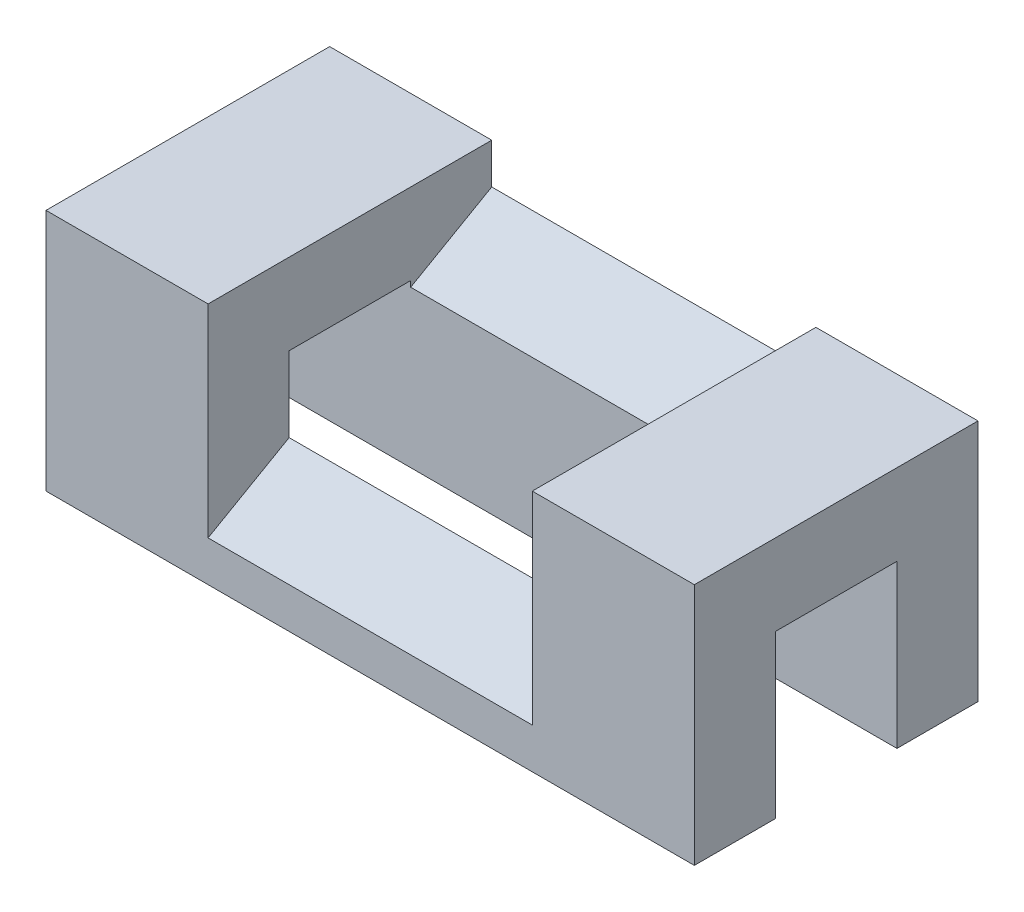
ISO-10303-21;
HEADER;
FILE_DESCRIPTION(('STEP AP214'),'2;1');
FILE_NAME('part.step','',(''),(''),'','','');
FILE_SCHEMA(('AUTOMOTIVE_DESIGN { 1 0 10303 214 1 1 1 1 }'));
ENDSEC;
DATA;
#1=APPLICATION_CONTEXT('core data for automotive mechanical design processes');
#2=APPLICATION_PROTOCOL_DEFINITION('international standard','automotive_design',2000,#1);
#3=PRODUCT_CONTEXT('',#1,'mechanical');
#4=PRODUCT('Part','Part','',(#3));
#5=PRODUCT_RELATED_PRODUCT_CATEGORY('part','',(#4));
#6=PRODUCT_DEFINITION_FORMATION('','',#4);
#7=PRODUCT_DEFINITION_CONTEXT('part definition',#1,'design');
#8=PRODUCT_DEFINITION('design','',#6,#7);
#9=PRODUCT_DEFINITION_SHAPE('','',#8);
#10=(LENGTH_UNIT() NAMED_UNIT(*) SI_UNIT(.MILLI.,.METRE.));
#11=(NAMED_UNIT(*) PLANE_ANGLE_UNIT() SI_UNIT($,.RADIAN.));
#12=(NAMED_UNIT(*) SI_UNIT($,.STERADIAN.) SOLID_ANGLE_UNIT());
#13=UNCERTAINTY_MEASURE_WITH_UNIT(LENGTH_MEASURE(1.E-05),#10,'distance_accuracy_value','');
#14=(GEOMETRIC_REPRESENTATION_CONTEXT(3) GLOBAL_UNCERTAINTY_ASSIGNED_CONTEXT((#13)) GLOBAL_UNIT_ASSIGNED_CONTEXT((#10,
#11,#12)) REPRESENTATION_CONTEXT('',''));
#15=CARTESIAN_POINT('',(0.,0.,0.));
#16=DIRECTION('',(0.,0.,1.));
#17=DIRECTION('',(1.,0.,0.));
#18=AXIS2_PLACEMENT_3D('',#15,#16,#17);
#19=CARTESIAN_POINT('',(40.,15.,17.5));
#20=DIRECTION('',(0.,0.,-1.));
#21=DIRECTION('',(0.,1.,0.));
#22=AXIS2_PLACEMENT_3D('',#19,#20,#21);
#23=PLANE('',#22);
#24=DIRECTION('',(0.,-1.,0.));
#25=VECTOR('',#24,1.);
#26=CARTESIAN_POINT('',(-20.,0.,17.5));
#27=LINE('',#26,#25);
#28=CARTESIAN_POINT('',(-20.,15.,17.5));
#29=VERTEX_POINT('',#28);
#30=CARTESIAN_POINT('',(-20.,-10.,17.5));
#31=VERTEX_POINT('',#30);
#32=EDGE_CURVE('E148',#29,#31,#27,.T.);
#33=ORIENTED_EDGE('',*,*,#32,.F.);
#34=DIRECTION('',(-1.,0.,0.));
#35=VECTOR('',#34,1.);
#36=CARTESIAN_POINT('',(40.,15.,17.5));
#37=LINE('',#36,#35);
#38=CARTESIAN_POINT('',(-40.,15.,17.5));
#39=VERTEX_POINT('',#38);
#40=EDGE_CURVE('E160',#29,#39,#37,.T.);
#41=ORIENTED_EDGE('',*,*,#40,.T.);
#42=DIRECTION('',(0.,-1.,0.));
#43=VECTOR('',#42,1.);
#44=CARTESIAN_POINT('',(-40.,15.,17.5));
#45=LINE('',#44,#43);
#46=CARTESIAN_POINT('',(-40.,-15.,17.5));
#47=VERTEX_POINT('',#46);
#48=EDGE_CURVE('E236',#39,#47,#45,.T.);
#49=ORIENTED_EDGE('',*,*,#48,.T.);
#50=DIRECTION('',(-1.,0.,0.));
#51=VECTOR('',#50,1.);
#52=CARTESIAN_POINT('',(40.,-15.,17.5));
#53=LINE('',#52,#51);
#54=CARTESIAN_POINT('',(40.,-15.,17.5));
#55=VERTEX_POINT('',#54);
#56=EDGE_CURVE('E185',#55,#47,#53,.T.);
#57=ORIENTED_EDGE('',*,*,#56,.F.);
#58=DIRECTION('',(0.,-1.,0.));
#59=VECTOR('',#58,1.);
#60=CARTESIAN_POINT('',(40.,15.,17.5));
#61=LINE('',#60,#59);
#62=CARTESIAN_POINT('',(40.,15.,17.5));
#63=VERTEX_POINT('',#62);
#64=EDGE_CURVE('E237',#63,#55,#61,.T.);
#65=ORIENTED_EDGE('',*,*,#64,.F.);
#66=CARTESIAN_POINT('',(20.,15.,17.5));
#67=VERTEX_POINT('',#66);
#68=EDGE_CURVE('E169',#63,#67,#37,.T.);
#69=ORIENTED_EDGE('',*,*,#68,.T.);
#70=DIRECTION('',(0.,-1.,0.));
#71=VECTOR('',#70,1.);
#72=CARTESIAN_POINT('',(20.,0.,17.5));
#73=LINE('',#72,#71);
#74=CARTESIAN_POINT('',(20.,-10.,17.5));
#75=VERTEX_POINT('',#74);
#76=EDGE_CURVE('E47',#67,#75,#73,.T.);
#77=ORIENTED_EDGE('',*,*,#76,.T.);
#78=DIRECTION('',(1.,0.,0.));
#79=VECTOR('',#78,1.);
#80=CARTESIAN_POINT('',(-20.,-10.,17.5));
#81=LINE('',#80,#79);
#82=EDGE_CURVE('E162',#31,#75,#81,.T.);
#83=ORIENTED_EDGE('',*,*,#82,.F.);
#84=EDGE_LOOP('',(#33,#41,#49,#57,#65,#69,#77,#83));
#85=FACE_BOUND('',#84,.T.);
#86=ADVANCED_FACE('F33',(#85),#23,.F.);
#87=CARTESIAN_POINT('',(40.,15.,-17.5));
#88=DIRECTION('',(0.,0.,1.));
#89=DIRECTION('',(0.,-1.,0.));
#90=AXIS2_PLACEMENT_3D('',#87,#88,#89);
#91=PLANE('',#90);
#92=DIRECTION('',(0.,1.,0.));
#93=VECTOR('',#92,1.);
#94=CARTESIAN_POINT('',(-20.,0.,-17.5));
#95=LINE('',#94,#93);
#96=CARTESIAN_POINT('',(-20.,10.,-17.5));
#97=VERTEX_POINT('',#96);
#98=CARTESIAN_POINT('',(-20.,15.,-17.5));
#99=VERTEX_POINT('',#98);
#100=EDGE_CURVE('E152',#97,#99,#95,.T.);
#101=ORIENTED_EDGE('',*,*,#100,.F.);
#102=DIRECTION('',(1.,0.,0.));
#103=VECTOR('',#102,1.);
#104=CARTESIAN_POINT('',(-20.,10.,-17.5));
#105=LINE('',#104,#103);
#106=CARTESIAN_POINT('',(20.,10.,-17.5));
#107=VERTEX_POINT('',#106);
#108=EDGE_CURVE('E224',#97,#107,#105,.T.);
#109=ORIENTED_EDGE('',*,*,#108,.T.);
#110=DIRECTION('',(0.,1.,0.));
#111=VECTOR('',#110,1.);
#112=CARTESIAN_POINT('',(20.,0.,-17.5));
#113=LINE('',#112,#111);
#114=CARTESIAN_POINT('',(20.,15.,-17.5));
#115=VERTEX_POINT('',#114);
#116=EDGE_CURVE('E156',#107,#115,#113,.T.);
#117=ORIENTED_EDGE('',*,*,#116,.T.);
#118=DIRECTION('',(-1.,0.,0.));
#119=VECTOR('',#118,1.);
#120=CARTESIAN_POINT('',(40.,15.,-17.5));
#121=LINE('',#120,#119);
#122=CARTESIAN_POINT('',(40.,15.,-17.5));
#123=VERTEX_POINT('',#122);
#124=EDGE_CURVE('E179',#123,#115,#121,.T.);
#125=ORIENTED_EDGE('',*,*,#124,.F.);
#126=DIRECTION('',(0.,1.,0.));
#127=VECTOR('',#126,1.);
#128=CARTESIAN_POINT('',(40.,15.,-17.5));
#129=LINE('',#128,#127);
#130=CARTESIAN_POINT('',(40.,-15.,-17.5));
#131=VERTEX_POINT('',#130);
#132=EDGE_CURVE('E174',#131,#123,#129,.T.);
#133=ORIENTED_EDGE('',*,*,#132,.F.);
#134=DIRECTION('',(-1.,0.,0.));
#135=VECTOR('',#134,1.);
#136=CARTESIAN_POINT('',(40.,-15.,-17.5));
#137=LINE('',#136,#135);
#138=CARTESIAN_POINT('',(-40.,-15.,-17.5));
#139=VERTEX_POINT('',#138);
#140=EDGE_CURVE('E182',#131,#139,#137,.T.);
#141=ORIENTED_EDGE('',*,*,#140,.T.);
#142=DIRECTION('',(0.,1.,0.));
#143=VECTOR('',#142,1.);
#144=CARTESIAN_POINT('',(-40.,15.,-17.5));
#145=LINE('',#144,#143);
#146=CARTESIAN_POINT('',(-40.,15.,-17.5));
#147=VERTEX_POINT('',#146);
#148=EDGE_CURVE('E247',#139,#147,#145,.T.);
#149=ORIENTED_EDGE('',*,*,#148,.T.);
#150=EDGE_CURVE('E173',#99,#147,#121,.T.);
#151=ORIENTED_EDGE('',*,*,#150,.F.);
#152=EDGE_LOOP('',(#101,#109,#117,#125,#133,#141,#149,#151));
#153=FACE_BOUND('',#152,.T.);
#154=ADVANCED_FACE('F250',(#153),#91,.F.);
#155=CARTESIAN_POINT('',(40.,15.,17.5));
#156=DIRECTION('',(0.,-1.,0.));
#157=DIRECTION('',(0.,0.,-1.));
#158=AXIS2_PLACEMENT_3D('',#155,#156,#157);
#159=PLANE('',#158);
#160=DIRECTION('',(0.,0.,1.));
#161=VECTOR('',#160,1.);
#162=CARTESIAN_POINT('',(-20.,15.,0.));
#163=LINE('',#162,#161);
#164=EDGE_CURVE('E144',#99,#29,#163,.T.);
#165=ORIENTED_EDGE('',*,*,#164,.F.);
#166=ORIENTED_EDGE('',*,*,#150,.T.);
#167=DIRECTION('',(0.,0.,1.));
#168=VECTOR('',#167,1.);
#169=CARTESIAN_POINT('',(-40.,15.,17.5));
#170=LINE('',#169,#168);
#171=EDGE_CURVE('E167',#147,#39,#170,.T.);
#172=ORIENTED_EDGE('',*,*,#171,.T.);
#173=ORIENTED_EDGE('',*,*,#40,.F.);
#174=EDGE_LOOP('',(#165,#166,#172,#173));
#175=FACE_BOUND('',#174,.T.);
#176=ADVANCED_FACE('F165',(#175),#159,.F.);
#177=CARTESIAN_POINT('',(-70.,0.,7.50000000000001));
#178=DIRECTION('',(0.,0.,-1.));
#179=DIRECTION('',(-1.,0.,0.));
#180=AXIS2_PLACEMENT_3D('',#177,#178,#179);
#181=PLANE('',#180);
#182=DIRECTION('',(1.,0.,0.));
#183=VECTOR('',#182,1.);
#184=CARTESIAN_POINT('',(-70.,5.,7.50000000000001));
#185=LINE('',#184,#183);
#186=CARTESIAN_POINT('',(-40.,5.,7.50000000000001));
#187=VERTEX_POINT('',#186);
#188=CARTESIAN_POINT('',(-20.,5.,7.50000000000001));
#189=VERTEX_POINT('',#188);
#190=EDGE_CURVE('E199',#187,#189,#185,.T.);
#191=ORIENTED_EDGE('',*,*,#190,.T.);
#192=DIRECTION('',(0.,1.,0.));
#193=VECTOR('',#192,1.);
#194=CARTESIAN_POINT('',(-20.,0.,7.50000000000001));
#195=LINE('',#194,#193);
#196=CARTESIAN_POINT('',(-20.,-4.28571428571428,7.50000000000001));
#197=VERTEX_POINT('',#196);
#198=EDGE_CURVE('E299',#197,#189,#195,.T.);
#199=ORIENTED_EDGE('',*,*,#198,.F.);
#200=DIRECTION('',(1.,0.,0.));
#201=VECTOR('',#200,1.);
#202=CARTESIAN_POINT('',(-20.,-4.28571428571428,7.50000000000001));
#203=LINE('',#202,#201);
#204=CARTESIAN_POINT('',(20.,-4.28571428571428,7.50000000000001));
#205=VERTEX_POINT('',#204);
#206=EDGE_CURVE('E285',#197,#205,#203,.T.);
#207=ORIENTED_EDGE('',*,*,#206,.T.);
#208=DIRECTION('',(0.,1.,0.));
#209=VECTOR('',#208,1.);
#210=CARTESIAN_POINT('',(20.,0.,7.50000000000001));
#211=LINE('',#210,#209);
#212=CARTESIAN_POINT('',(20.,5.,7.50000000000001));
#213=VERTEX_POINT('',#212);
#214=EDGE_CURVE('E266',#205,#213,#211,.T.);
#215=ORIENTED_EDGE('',*,*,#214,.T.);
#216=CARTESIAN_POINT('',(40.,5.,7.50000000000001));
#217=VERTEX_POINT('',#216);
#218=EDGE_CURVE('E288',#213,#217,#185,.T.);
#219=ORIENTED_EDGE('',*,*,#218,.T.);
#220=DIRECTION('',(0.,1.,0.));
#221=VECTOR('',#220,1.);
#222=CARTESIAN_POINT('',(40.,0.,7.50000000000001));
#223=LINE('',#222,#221);
#224=CARTESIAN_POINT('',(40.,-15.,7.50000000000001));
#225=VERTEX_POINT('',#224);
#226=EDGE_CURVE('E233',#225,#217,#223,.T.);
#227=ORIENTED_EDGE('',*,*,#226,.F.);
#228=DIRECTION('',(1.,0.,0.));
#229=VECTOR('',#228,1.);
#230=CARTESIAN_POINT('',(-70.,-15.,7.50000000000001));
#231=LINE('',#230,#229);
#232=CARTESIAN_POINT('',(-40.,-15.,7.50000000000001));
#233=VERTEX_POINT('',#232);
#234=EDGE_CURVE('E220',#233,#225,#231,.T.);
#235=ORIENTED_EDGE('',*,*,#234,.F.);
#236=DIRECTION('',(0.,1.,0.));
#237=VECTOR('',#236,1.);
#238=CARTESIAN_POINT('',(-40.,0.,7.50000000000001));
#239=LINE('',#238,#237);
#240=EDGE_CURVE('E11',#233,#187,#239,.T.);
#241=ORIENTED_EDGE('',*,*,#240,.T.);
#242=EDGE_LOOP('',(#191,#199,#207,#215,#219,#227,#235,#241));
#243=FACE_BOUND('',#242,.T.);
#244=ADVANCED_FACE('F293',(#243),#181,.T.);
#245=CARTESIAN_POINT('',(-70.,5.,0.));
#246=DIRECTION('',(0.,-1.,0.));
#247=DIRECTION('',(0.,0.,-1.));
#248=AXIS2_PLACEMENT_3D('',#245,#246,#247);
#249=PLANE('',#248);
#250=DIRECTION('',(1.,0.,0.));
#251=VECTOR('',#250,1.);
#252=CARTESIAN_POINT('',(-70.,5.,-7.50000000000001));
#253=LINE('',#252,#251);
#254=CARTESIAN_POINT('',(-40.,5.,-7.50000000000001));
#255=VERTEX_POINT('',#254);
#256=CARTESIAN_POINT('',(-20.,5.,-7.50000000000001));
#257=VERTEX_POINT('',#256);
#258=EDGE_CURVE('E197',#255,#257,#253,.T.);
#259=ORIENTED_EDGE('',*,*,#258,.T.);
#260=DIRECTION('',(0.,0.,-1.));
#261=VECTOR('',#260,1.);
#262=CARTESIAN_POINT('',(-20.,5.,0.));
#263=LINE('',#262,#261);
#264=EDGE_CURVE('E304',#189,#257,#263,.T.);
#265=ORIENTED_EDGE('',*,*,#264,.F.);
#266=ORIENTED_EDGE('',*,*,#190,.F.);
#267=DIRECTION('',(0.,0.,-1.));
#268=VECTOR('',#267,1.);
#269=CARTESIAN_POINT('',(-40.,5.,0.));
#270=LINE('',#269,#268);
#271=EDGE_CURVE('E40',#187,#255,#270,.T.);
#272=ORIENTED_EDGE('',*,*,#271,.T.);
#273=EDGE_LOOP('',(#259,#265,#266,#272));
#274=FACE_BOUND('',#273,.T.);
#275=ADVANCED_FACE('F195',(#274),#249,.T.);
#276=CARTESIAN_POINT('',(-70.,0.,-7.50000000000001));
#277=DIRECTION('',(0.,0.,1.));
#278=DIRECTION('',(0.,-1.,0.));
#279=AXIS2_PLACEMENT_3D('',#276,#277,#278);
#280=PLANE('',#279);
#281=DIRECTION('',(1.,0.,0.));
#282=VECTOR('',#281,1.);
#283=CARTESIAN_POINT('',(-20.,4.28571428571429,-7.50000000000001));
#284=LINE('',#283,#282);
#285=CARTESIAN_POINT('',(-20.,4.28571428571429,-7.50000000000001));
#286=VERTEX_POINT('',#285);
#287=CARTESIAN_POINT('',(20.,4.28571428571429,-7.50000000000001));
#288=VERTEX_POINT('',#287);
#289=EDGE_CURVE('E283',#286,#288,#284,.T.);
#290=ORIENTED_EDGE('',*,*,#289,.F.);
#291=DIRECTION('',(0.,-1.,0.));
#292=VECTOR('',#291,1.);
#293=CARTESIAN_POINT('',(-20.,0.,-7.50000000000001));
#294=LINE('',#293,#292);
#295=EDGE_CURVE('E306',#257,#286,#294,.T.);
#296=ORIENTED_EDGE('',*,*,#295,.F.);
#297=ORIENTED_EDGE('',*,*,#258,.F.);
#298=DIRECTION('',(0.,-1.,0.));
#299=VECTOR('',#298,1.);
#300=CARTESIAN_POINT('',(-40.,0.,-7.50000000000001));
#301=LINE('',#300,#299);
#302=CARTESIAN_POINT('',(-40.,-15.,-7.50000000000001));
#303=VERTEX_POINT('',#302);
#304=EDGE_CURVE('E188',#255,#303,#301,.T.);
#305=ORIENTED_EDGE('',*,*,#304,.T.);
#306=DIRECTION('',(1.,0.,0.));
#307=VECTOR('',#306,1.);
#308=CARTESIAN_POINT('',(-70.,-15.,-7.50000000000001));
#309=LINE('',#308,#307);
#310=CARTESIAN_POINT('',(40.,-15.,-7.50000000000001));
#311=VERTEX_POINT('',#310);
#312=EDGE_CURVE('E211',#303,#311,#309,.T.);
#313=ORIENTED_EDGE('',*,*,#312,.T.);
#314=DIRECTION('',(0.,-1.,0.));
#315=VECTOR('',#314,1.);
#316=CARTESIAN_POINT('',(40.,0.,-7.50000000000001));
#317=LINE('',#316,#315);
#318=CARTESIAN_POINT('',(40.,5.,-7.50000000000001));
#319=VERTEX_POINT('',#318);
#320=EDGE_CURVE('E228',#319,#311,#317,.T.);
#321=ORIENTED_EDGE('',*,*,#320,.F.);
#322=CARTESIAN_POINT('',(20.,5.,-7.50000000000001));
#323=VERTEX_POINT('',#322);
#324=EDGE_CURVE('E219',#323,#319,#253,.T.);
#325=ORIENTED_EDGE('',*,*,#324,.F.);
#326=DIRECTION('',(0.,-1.,0.));
#327=VECTOR('',#326,1.);
#328=CARTESIAN_POINT('',(20.,0.,-7.50000000000001));
#329=LINE('',#328,#327);
#330=EDGE_CURVE('E276',#323,#288,#329,.T.);
#331=ORIENTED_EDGE('',*,*,#330,.T.);
#332=EDGE_LOOP('',(#290,#296,#297,#305,#313,#321,#325,#331));
#333=FACE_BOUND('',#332,.T.);
#334=ADVANCED_FACE('F209',(#333),#280,.T.);
#335=CARTESIAN_POINT('',(40.,-15.,17.5));
#336=DIRECTION('',(0.,1.,0.));
#337=DIRECTION('',(0.,0.,1.));
#338=AXIS2_PLACEMENT_3D('',#335,#336,#337);
#339=PLANE('',#338);
#340=ORIENTED_EDGE('',*,*,#234,.T.);
#341=DIRECTION('',(0.,0.,-1.));
#342=VECTOR('',#341,1.);
#343=CARTESIAN_POINT('',(40.,-15.,17.5));
#344=LINE('',#343,#342);
#345=EDGE_CURVE('E240',#55,#225,#344,.T.);
#346=ORIENTED_EDGE('',*,*,#345,.F.);
#347=ORIENTED_EDGE('',*,*,#56,.T.);
#348=DIRECTION('',(0.,0.,-1.));
#349=VECTOR('',#348,1.);
#350=CARTESIAN_POINT('',(-40.,-15.,17.5));
#351=LINE('',#350,#349);
#352=EDGE_CURVE('E245',#47,#233,#351,.T.);
#353=ORIENTED_EDGE('',*,*,#352,.T.);
#354=EDGE_LOOP('',(#340,#346,#347,#353));
#355=FACE_BOUND('',#354,.T.);
#356=ADVANCED_FACE('F255',(#355),#339,.F.);
#357=ORIENTED_EDGE('',*,*,#312,.F.);
#358=EDGE_CURVE('E205',#303,#139,#351,.T.);
#359=ORIENTED_EDGE('',*,*,#358,.T.);
#360=ORIENTED_EDGE('',*,*,#140,.F.);
#361=EDGE_CURVE('E218',#311,#131,#344,.T.);
#362=ORIENTED_EDGE('',*,*,#361,.F.);
#363=EDGE_LOOP('',(#357,#359,#360,#362));
#364=FACE_BOUND('',#363,.T.);
#365=ADVANCED_FACE('F216',(#364),#339,.F.);
#366=CARTESIAN_POINT('',(40.,0.,0.));
#367=DIRECTION('',(1.,0.,0.));
#368=DIRECTION('',(0.,0.,-1.));
#369=AXIS2_PLACEMENT_3D('',#366,#367,#368);
#370=PLANE('',#369);
#371=ORIENTED_EDGE('',*,*,#345,.T.);
#372=ORIENTED_EDGE('',*,*,#226,.T.);
#373=DIRECTION('',(0.,0.,-1.));
#374=VECTOR('',#373,1.);
#375=CARTESIAN_POINT('',(40.,5.,0.));
#376=LINE('',#375,#374);
#377=EDGE_CURVE('E230',#217,#319,#376,.T.);
#378=ORIENTED_EDGE('',*,*,#377,.T.);
#379=ORIENTED_EDGE('',*,*,#320,.T.);
#380=ORIENTED_EDGE('',*,*,#361,.T.);
#381=ORIENTED_EDGE('',*,*,#132,.T.);
#382=DIRECTION('',(0.,0.,1.));
#383=VECTOR('',#382,1.);
#384=CARTESIAN_POINT('',(40.,15.,17.5));
#385=LINE('',#384,#383);
#386=EDGE_CURVE('E170',#123,#63,#385,.T.);
#387=ORIENTED_EDGE('',*,*,#386,.T.);
#388=ORIENTED_EDGE('',*,*,#64,.T.);
#389=EDGE_LOOP('',(#371,#372,#378,#379,#380,#381,#387,#388));
#390=FACE_BOUND('',#389,.T.);
#391=ADVANCED_FACE('F257',(#390),#370,.T.);
#392=CARTESIAN_POINT('',(-40.,0.,0.));
#393=DIRECTION('',(1.,0.,0.));
#394=DIRECTION('',(0.,0.,-1.));
#395=AXIS2_PLACEMENT_3D('',#392,#393,#394);
#396=PLANE('',#395);
#397=ORIENTED_EDGE('',*,*,#240,.F.);
#398=ORIENTED_EDGE('',*,*,#352,.F.);
#399=ORIENTED_EDGE('',*,*,#48,.F.);
#400=ORIENTED_EDGE('',*,*,#171,.F.);
#401=ORIENTED_EDGE('',*,*,#148,.F.);
#402=ORIENTED_EDGE('',*,*,#358,.F.);
#403=ORIENTED_EDGE('',*,*,#304,.F.);
#404=ORIENTED_EDGE('',*,*,#271,.F.);
#405=EDGE_LOOP('',(#397,#398,#399,#400,#401,#402,#403,#404));
#406=FACE_BOUND('',#405,.T.);
#407=ADVANCED_FACE('F203',(#406),#396,.F.);
#408=ORIENTED_EDGE('',*,*,#124,.T.);
#409=DIRECTION('',(0.,0.,1.));
#410=VECTOR('',#409,1.);
#411=CARTESIAN_POINT('',(20.,15.,0.));
#412=LINE('',#411,#410);
#413=EDGE_CURVE('E263',#115,#67,#412,.T.);
#414=ORIENTED_EDGE('',*,*,#413,.T.);
#415=ORIENTED_EDGE('',*,*,#68,.F.);
#416=ORIENTED_EDGE('',*,*,#386,.F.);
#417=EDGE_LOOP('',(#408,#414,#415,#416));
#418=FACE_BOUND('',#417,.T.);
#419=ADVANCED_FACE('F262',(#418),#159,.F.);
#420=DIRECTION('',(0.,0.,-1.));
#421=VECTOR('',#420,1.);
#422=CARTESIAN_POINT('',(20.,5.,0.));
#423=LINE('',#422,#421);
#424=EDGE_CURVE('E273',#213,#323,#423,.T.);
#425=ORIENTED_EDGE('',*,*,#424,.T.);
#426=ORIENTED_EDGE('',*,*,#324,.T.);
#427=ORIENTED_EDGE('',*,*,#377,.F.);
#428=ORIENTED_EDGE('',*,*,#218,.F.);
#429=EDGE_LOOP('',(#425,#426,#427,#428));
#430=FACE_BOUND('',#429,.T.);
#431=ADVANCED_FACE('F296',(#430),#249,.T.);
#432=CARTESIAN_POINT('',(-20.,0.,0.));
#433=DIRECTION('',(0.,0.868243142124459,0.496138938356834));
#434=DIRECTION('',(0.,-0.496138938356834,0.868243142124459));
#435=AXIS2_PLACEMENT_3D('',#432,#433,#434);
#436=PLANE('',#435);
#437=DIRECTION('',(0.,-0.496138938356834,0.868243142124459));
#438=VECTOR('',#437,1.);
#439=CARTESIAN_POINT('',(20.,0.,0.));
#440=LINE('',#439,#438);
#441=EDGE_CURVE('E54',#107,#288,#440,.T.);
#442=ORIENTED_EDGE('',*,*,#441,.F.);
#443=ORIENTED_EDGE('',*,*,#108,.F.);
#444=DIRECTION('',(0.,-0.496138938356834,0.868243142124459));
#445=VECTOR('',#444,1.);
#446=CARTESIAN_POINT('',(-20.,0.,0.));
#447=LINE('',#446,#445);
#448=EDGE_CURVE('E303',#97,#286,#447,.T.);
#449=ORIENTED_EDGE('',*,*,#448,.T.);
#450=ORIENTED_EDGE('',*,*,#289,.T.);
#451=EDGE_LOOP('',(#442,#443,#449,#450));
#452=FACE_BOUND('',#451,.T.);
#453=ADVANCED_FACE('F311',(#452),#436,.T.);
#454=EDGE_CURVE('E264',#205,#75,#440,.T.);
#455=ORIENTED_EDGE('',*,*,#454,.F.);
#456=ORIENTED_EDGE('',*,*,#206,.F.);
#457=EDGE_CURVE('E163',#197,#31,#447,.T.);
#458=ORIENTED_EDGE('',*,*,#457,.T.);
#459=ORIENTED_EDGE('',*,*,#82,.T.);
#460=EDGE_LOOP('',(#455,#456,#458,#459));
#461=FACE_BOUND('',#460,.T.);
#462=ADVANCED_FACE('F301',(#461),#436,.T.);
#463=CARTESIAN_POINT('',(-20.,0.,0.));
#464=DIRECTION('',(1.,0.,0.));
#465=DIRECTION('',(0.,0.,-1.));
#466=AXIS2_PLACEMENT_3D('',#463,#464,#465);
#467=PLANE('',#466);
#468=ORIENTED_EDGE('',*,*,#164,.T.);
#469=ORIENTED_EDGE('',*,*,#32,.T.);
#470=ORIENTED_EDGE('',*,*,#457,.F.);
#471=ORIENTED_EDGE('',*,*,#198,.T.);
#472=ORIENTED_EDGE('',*,*,#264,.T.);
#473=ORIENTED_EDGE('',*,*,#295,.T.);
#474=ORIENTED_EDGE('',*,*,#448,.F.);
#475=ORIENTED_EDGE('',*,*,#100,.T.);
#476=EDGE_LOOP('',(#468,#469,#470,#471,#472,#473,#474,#475));
#477=FACE_BOUND('',#476,.T.);
#478=ADVANCED_FACE('F146',(#477),#467,.T.);
#479=CARTESIAN_POINT('',(20.,0.,0.));
#480=DIRECTION('',(1.,0.,0.));
#481=DIRECTION('',(0.,0.,-1.));
#482=AXIS2_PLACEMENT_3D('',#479,#480,#481);
#483=PLANE('',#482);
#484=ORIENTED_EDGE('',*,*,#413,.F.);
#485=ORIENTED_EDGE('',*,*,#116,.F.);
#486=ORIENTED_EDGE('',*,*,#441,.T.);
#487=ORIENTED_EDGE('',*,*,#330,.F.);
#488=ORIENTED_EDGE('',*,*,#424,.F.);
#489=ORIENTED_EDGE('',*,*,#214,.F.);
#490=ORIENTED_EDGE('',*,*,#454,.T.);
#491=ORIENTED_EDGE('',*,*,#76,.F.);
#492=EDGE_LOOP('',(#484,#485,#486,#487,#488,#489,#490,#491));
#493=FACE_BOUND('',#492,.T.);
#494=ADVANCED_FACE('F298',(#493),#483,.F.);
#495=CLOSED_SHELL('',(#86,#154,#176,#244,#275,#334,#356,#365,#391,#407,#419,#431,#453,#462,#478,#494));
#496=MANIFOLD_SOLID_BREP('B2',#495);
#497=ADVANCED_BREP_SHAPE_REPRESENTATION('',(#18,#496),#14);
#498=SHAPE_DEFINITION_REPRESENTATION(#9,#497);
ENDSEC;
END-ISO-10303-21;
